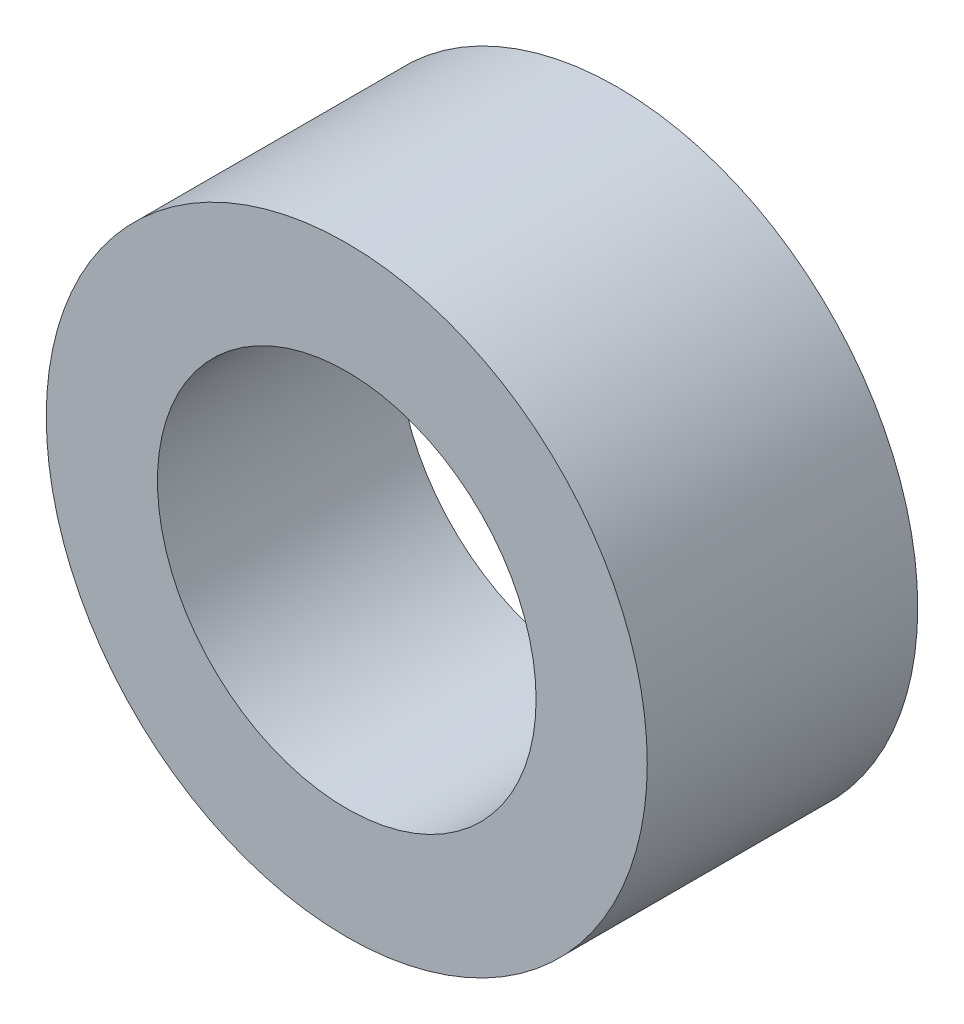
ISO-10303-21;
HEADER;
FILE_DESCRIPTION(('STEP AP214'),'2;1');
FILE_NAME('part.step','',(''),(''),'','','');
FILE_SCHEMA(('AUTOMOTIVE_DESIGN { 1 0 10303 214 1 1 1 1 }'));
ENDSEC;
DATA;
#1=APPLICATION_CONTEXT('core data for automotive mechanical design processes');
#2=APPLICATION_PROTOCOL_DEFINITION('international standard','automotive_design',2000,#1);
#3=PRODUCT_CONTEXT('',#1,'mechanical');
#4=PRODUCT('Part','Part','',(#3));
#5=PRODUCT_RELATED_PRODUCT_CATEGORY('part','',(#4));
#6=PRODUCT_DEFINITION_FORMATION('','',#4);
#7=PRODUCT_DEFINITION_CONTEXT('part definition',#1,'design');
#8=PRODUCT_DEFINITION('design','',#6,#7);
#9=PRODUCT_DEFINITION_SHAPE('','',#8);
#10=(LENGTH_UNIT() NAMED_UNIT(*) SI_UNIT(.MILLI.,.METRE.));
#11=(NAMED_UNIT(*) PLANE_ANGLE_UNIT() SI_UNIT($,.RADIAN.));
#12=(NAMED_UNIT(*) SI_UNIT($,.STERADIAN.) SOLID_ANGLE_UNIT());
#13=UNCERTAINTY_MEASURE_WITH_UNIT(LENGTH_MEASURE(1.E-05),#10,'distance_accuracy_value','');
#14=(GEOMETRIC_REPRESENTATION_CONTEXT(3) GLOBAL_UNCERTAINTY_ASSIGNED_CONTEXT((#13)) GLOBAL_UNIT_ASSIGNED_CONTEXT((#10,
#11,#12)) REPRESENTATION_CONTEXT('',''));
#15=CARTESIAN_POINT('',(0.,0.,0.));
#16=DIRECTION('',(0.,0.,1.));
#17=DIRECTION('',(1.,0.,0.));
#18=AXIS2_PLACEMENT_3D('',#15,#16,#17);
#19=CARTESIAN_POINT('',(0.,0.,8.));
#20=DIRECTION('',(0.,0.,-1.));
#21=DIRECTION('',(-1.,0.,0.));
#22=AXIS2_PLACEMENT_3D('',#19,#20,#21);
#23=CYLINDRICAL_SURFACE('',#22,10.);
#24=CARTESIAN_POINT('',(0.,0.,8.));
#25=DIRECTION('',(0.,0.,1.));
#26=DIRECTION('',(1.,0.,0.));
#27=AXIS2_PLACEMENT_3D('',#24,#25,#26);
#28=CIRCLE('',#27,10.);
#29=CARTESIAN_POINT('',(10.,0.,8.));
#30=VERTEX_POINT('',#29);
#31=EDGE_CURVE('E10',#30,#30,#28,.T.);
#32=ORIENTED_EDGE('',*,*,#31,.F.);
#33=EDGE_LOOP('',(#32));
#34=FACE_BOUND('',#33,.T.);
#35=CARTESIAN_POINT('',(0.,0.,-1.));
#36=DIRECTION('',(0.,0.,-1.));
#37=DIRECTION('',(-1.,0.,0.));
#38=AXIS2_PLACEMENT_3D('',#35,#36,#37);
#39=CIRCLE('',#38,10.);
#40=CARTESIAN_POINT('',(-10.,0.,-1.));
#41=VERTEX_POINT('',#40);
#42=EDGE_CURVE('E44',#41,#41,#39,.T.);
#43=ORIENTED_EDGE('',*,*,#42,.F.);
#44=EDGE_LOOP('',(#43));
#45=FACE_BOUND('',#44,.T.);
#46=ADVANCED_FACE('F37',(#34,#45),#23,.T.);
#47=CARTESIAN_POINT('',(0.,0.,8.));
#48=DIRECTION('',(0.,0.,1.));
#49=DIRECTION('',(1.,0.,0.));
#50=AXIS2_PLACEMENT_3D('',#47,#48,#49);
#51=PLANE('',#50);
#52=CARTESIAN_POINT('',(0.,0.,8.));
#53=DIRECTION('',(0.,0.,1.));
#54=DIRECTION('',(1.,0.,0.));
#55=AXIS2_PLACEMENT_3D('',#52,#53,#54);
#56=CIRCLE('',#55,6.3);
#57=CARTESIAN_POINT('',(6.3,0.,8.));
#58=VERTEX_POINT('',#57);
#59=EDGE_CURVE('E56',#58,#58,#56,.T.);
#60=ORIENTED_EDGE('',*,*,#59,.F.);
#61=EDGE_LOOP('',(#60));
#62=FACE_BOUND('',#61,.T.);
#63=ORIENTED_EDGE('',*,*,#31,.T.);
#64=EDGE_LOOP('',(#63));
#65=FACE_BOUND('',#64,.T.);
#66=ADVANCED_FACE('F75',(#62,#65),#51,.T.);
#67=CARTESIAN_POINT('',(0.,0.,-1.));
#68=DIRECTION('',(0.,0.,-1.));
#69=DIRECTION('',(-1.,0.,0.));
#70=AXIS2_PLACEMENT_3D('',#67,#68,#69);
#71=PLANE('',#70);
#72=ORIENTED_EDGE('',*,*,#42,.T.);
#73=EDGE_LOOP('',(#72));
#74=FACE_BOUND('',#73,.T.);
#75=CARTESIAN_POINT('',(0.,0.,-1.));
#76=DIRECTION('',(0.,0.,-1.));
#77=DIRECTION('',(-1.,0.,0.));
#78=AXIS2_PLACEMENT_3D('',#75,#76,#77);
#79=CIRCLE('',#78,9.);
#80=CARTESIAN_POINT('',(-9.,0.,-1.));
#81=VERTEX_POINT('',#80);
#82=EDGE_CURVE('E48',#81,#81,#79,.T.);
#83=ORIENTED_EDGE('',*,*,#82,.F.);
#84=EDGE_LOOP('',(#83));
#85=FACE_BOUND('',#84,.T.);
#86=ADVANCED_FACE('F80',(#74,#85),#71,.T.);
#87=CARTESIAN_POINT('',(0.,0.,-1.));
#88=DIRECTION('',(0.,0.,1.));
#89=DIRECTION('',(1.,0.,0.));
#90=AXIS2_PLACEMENT_3D('',#87,#88,#89);
#91=CYLINDRICAL_SURFACE('',#90,9.);
#92=ORIENTED_EDGE('',*,*,#82,.T.);
#93=EDGE_LOOP('',(#92));
#94=FACE_BOUND('',#93,.T.);
#95=CARTESIAN_POINT('',(0.,0.,0.));
#96=DIRECTION('',(0.,0.,-1.));
#97=DIRECTION('',(-1.,0.,0.));
#98=AXIS2_PLACEMENT_3D('',#95,#96,#97);
#99=CIRCLE('',#98,9.);
#100=CARTESIAN_POINT('',(-9.,0.,0.));
#101=VERTEX_POINT('',#100);
#102=EDGE_CURVE('E51',#101,#101,#99,.T.);
#103=ORIENTED_EDGE('',*,*,#102,.F.);
#104=EDGE_LOOP('',(#103));
#105=FACE_BOUND('',#104,.T.);
#106=ADVANCED_FACE('F72',(#94,#105),#91,.F.);
#107=CARTESIAN_POINT('',(0.,0.,0.));
#108=DIRECTION('',(0.,0.,1.));
#109=DIRECTION('',(1.,0.,0.));
#110=AXIS2_PLACEMENT_3D('',#107,#108,#109);
#111=PLANE('',#110);
#112=CARTESIAN_POINT('',(0.,0.,0.));
#113=DIRECTION('',(0.,0.,1.));
#114=DIRECTION('',(1.,0.,0.));
#115=AXIS2_PLACEMENT_3D('',#112,#113,#114);
#116=CIRCLE('',#115,6.3);
#117=CARTESIAN_POINT('',(6.3,0.,0.));
#118=VERTEX_POINT('',#117);
#119=EDGE_CURVE('E40',#118,#118,#116,.T.);
#120=ORIENTED_EDGE('',*,*,#119,.T.);
#121=EDGE_LOOP('',(#120));
#122=FACE_BOUND('',#121,.T.);
#123=ORIENTED_EDGE('',*,*,#102,.T.);
#124=EDGE_LOOP('',(#123));
#125=FACE_BOUND('',#124,.T.);
#126=ADVANCED_FACE('F63',(#122,#125),#111,.F.);
#127=CARTESIAN_POINT('',(0.,0.,-1.));
#128=DIRECTION('',(0.,0.,1.));
#129=DIRECTION('',(1.,0.,0.));
#130=AXIS2_PLACEMENT_3D('',#127,#128,#129);
#131=CYLINDRICAL_SURFACE('',#130,6.3);
#132=ORIENTED_EDGE('',*,*,#59,.T.);
#133=EDGE_LOOP('',(#132));
#134=FACE_BOUND('',#133,.T.);
#135=ORIENTED_EDGE('',*,*,#119,.F.);
#136=EDGE_LOOP('',(#135));
#137=FACE_BOUND('',#136,.T.);
#138=ADVANCED_FACE('F66',(#134,#137),#131,.F.);
#139=CLOSED_SHELL('',(#46,#66,#86,#106,#126,#138));
#140=MANIFOLD_SOLID_BREP('B2',#139);
#141=ADVANCED_BREP_SHAPE_REPRESENTATION('',(#18,#140),#14);
#142=SHAPE_DEFINITION_REPRESENTATION(#9,#141);
ENDSEC;
END-ISO-10303-21;
